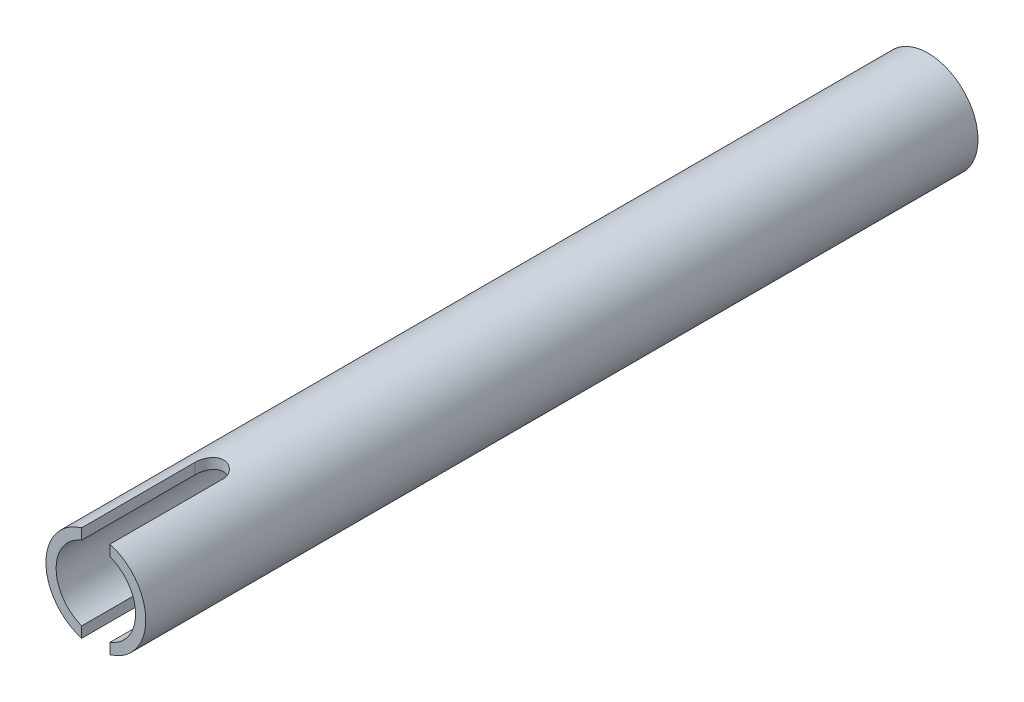
ISO-10303-21;
HEADER;
FILE_DESCRIPTION(('STEP AP214'),'2;1');
FILE_NAME('part.step','',(''),(''),'','','');
FILE_SCHEMA(('AUTOMOTIVE_DESIGN { 1 0 10303 214 1 1 1 1 }'));
ENDSEC;
DATA;
#1=APPLICATION_CONTEXT('core data for automotive mechanical design processes');
#2=APPLICATION_PROTOCOL_DEFINITION('international standard','automotive_design',2000,#1);
#3=PRODUCT_CONTEXT('',#1,'mechanical');
#4=PRODUCT('Part','Part','',(#3));
#5=PRODUCT_RELATED_PRODUCT_CATEGORY('part','',(#4));
#6=PRODUCT_DEFINITION_FORMATION('','',#4);
#7=PRODUCT_DEFINITION_CONTEXT('part definition',#1,'design');
#8=PRODUCT_DEFINITION('design','',#6,#7);
#9=PRODUCT_DEFINITION_SHAPE('','',#8);
#10=(LENGTH_UNIT() NAMED_UNIT(*) SI_UNIT(.MILLI.,.METRE.));
#11=(NAMED_UNIT(*) PLANE_ANGLE_UNIT() SI_UNIT($,.RADIAN.));
#12=(NAMED_UNIT(*) SI_UNIT($,.STERADIAN.) SOLID_ANGLE_UNIT());
#13=UNCERTAINTY_MEASURE_WITH_UNIT(LENGTH_MEASURE(1.E-05),#10,'distance_accuracy_value','');
#14=(GEOMETRIC_REPRESENTATION_CONTEXT(3) GLOBAL_UNCERTAINTY_ASSIGNED_CONTEXT((#13)) GLOBAL_UNIT_ASSIGNED_CONTEXT((#10,
#11,#12)) REPRESENTATION_CONTEXT('',''));
#15=CARTESIAN_POINT('',(0.,0.,0.));
#16=DIRECTION('',(0.,0.,1.));
#17=DIRECTION('',(1.,0.,0.));
#18=AXIS2_PLACEMENT_3D('',#15,#16,#17);
#19=CARTESIAN_POINT('',(0.,0.,139.7));
#20=DIRECTION('',(0.,0.,-1.));
#21=DIRECTION('',(0.,-1.,0.));
#22=AXIS2_PLACEMENT_3D('',#19,#20,#21);
#23=CYLINDRICAL_SURFACE('',#22,13.335);
#24=CARTESIAN_POINT('',(0.,0.,139.7));
#25=DIRECTION('',(0.,0.,1.));
#26=DIRECTION('',(1.,0.,0.));
#27=AXIS2_PLACEMENT_3D('',#24,#25,#26);
#28=CIRCLE('',#27,13.335);
#29=CARTESIAN_POINT('',(-4.7625,12.4555537311675,139.7));
#30=VERTEX_POINT('',#29);
#31=CARTESIAN_POINT('',(-4.7625,-12.4555537311675,139.7));
#32=VERTEX_POINT('',#31);
#33=EDGE_CURVE('E10',#30,#32,#28,.T.);
#34=ORIENTED_EDGE('',*,*,#33,.T.);
#35=DIRECTION('',(0.,0.,-1.));
#36=VECTOR('',#35,1.);
#37=CARTESIAN_POINT('',(-4.7625,-12.4555537311675,139.7));
#38=LINE('',#37,#36);
#39=CARTESIAN_POINT('',(-4.7625,-12.4555537311675,101.6));
#40=VERTEX_POINT('',#39);
#41=EDGE_CURVE('E36',#40,#32,#38,.F.);
#42=ORIENTED_EDGE('',*,*,#41,.F.);
#43=CARTESIAN_POINT('',(4.7625,-12.4555537311675,101.6));
#44=CARTESIAN_POINT('',(4.76251896990271,-12.4555305189485,101.470673163287));
#45=CARTESIAN_POINT('',(4.75723299616556,-12.4575671832439,101.341355556356));
#46=CARTESIAN_POINT('',(4.73619329008176,-12.4655898676531,101.083736462585));
#47=CARTESIAN_POINT('',(4.72044276284744,-12.4715746785138,100.955434676787));
#48=CARTESIAN_POINT('',(4.67868454557774,-12.4872976126237,100.701182373112));
#49=CARTESIAN_POINT('',(4.65271068361798,-12.4970233550824,100.575225521194));
#50=CARTESIAN_POINT('',(4.59076223314851,-12.5199130771229,100.326115426862));
#51=CARTESIAN_POINT('',(4.55478720234718,-12.5330772087624,100.202962308702));
#52=CARTESIAN_POINT('',(4.47319367156665,-12.56242958728,99.960397053191));
#53=CARTESIAN_POINT('',(4.42758463863456,-12.5786148635662,99.8409813744779));
#54=CARTESIAN_POINT('',(4.32708190477261,-12.6135409336953,99.6064943110917));
#55=CARTESIAN_POINT('',(4.27218473120114,-12.6322826828404,99.4914245710299));
#56=CARTESIAN_POINT('',(4.09411486494907,-12.6915769420752,99.1537155394354));
#57=CARTESIAN_POINT('',(3.95753892056841,-12.7352078663829,98.938502892756));
#58=CARTESIAN_POINT('',(3.64620053920867,-12.8278921512168,98.5248705082343));
#59=CARTESIAN_POINT('',(3.47011137628828,-12.8770938457904,98.3274891841221));
#60=CARTESIAN_POINT('',(3.08750300346686,-12.9741458477122,97.9643042006167));
#61=CARTESIAN_POINT('',(2.88097813618253,-13.0219959018428,97.7985064251322));
#62=CARTESIAN_POINT('',(2.43561570239317,-13.112708448999,97.4983601067961));
#63=CARTESIAN_POINT('',(2.1959852136657,-13.1553745074699,97.3651239550014));
#64=CARTESIAN_POINT('',(1.69592819242424,-13.2291268172402,97.1412786833634));
#65=CARTESIAN_POINT('',(1.43550882698456,-13.2602170386113,97.050654946274));
#66=CARTESIAN_POINT('',(0.912171018747993,-13.3062545370507,96.9181943979613));
#67=CARTESIAN_POINT('',(0.649757067674647,-13.3217906307815,96.8745728755163));
#68=CARTESIAN_POINT('',(0.120899520019168,-13.3370725945615,96.8316547736225));
#69=CARTESIAN_POINT('',(-0.145542940966851,-13.3368228344738,96.8323459274747));
#70=CARTESIAN_POINT('',(-0.662165140245541,-13.3209460240892,96.8769549107394));
#71=CARTESIAN_POINT('',(-0.91253760153073,-13.3060105649123,96.9189286495626));
#72=CARTESIAN_POINT('',(-1.40241500609256,-13.2633306846173,97.0416655564185));
#73=CARTESIAN_POINT('',(-1.64191933438317,-13.2355855396382,97.1224309165321));
#74=CARTESIAN_POINT('',(-2.1072364281454,-13.1695795478674,97.3214586893408));
#75=CARTESIAN_POINT('',(-2.33280995091872,-13.13117662438,97.4402312978102));
#76=CARTESIAN_POINT('',(-2.76136598704558,-13.0477895807366,97.7114771735614));
#77=CARTESIAN_POINT('',(-2.96434161071919,-13.0028034631091,97.8639606765927));
#78=CARTESIAN_POINT('',(-3.35341329937753,-12.9081012878604,98.2078008266147));
#79=CARTESIAN_POINT('',(-3.53802744445235,-12.8582609355424,98.4007995107919));
#80=CARTESIAN_POINT('',(-3.8728816728411,-12.7614058483055,98.8155518539991));
#81=CARTESIAN_POINT('',(-4.02310944133483,-12.7143921301219,99.0373157703381));
#82=CARTESIAN_POINT('',(-4.22058236280989,-12.6496573132555,99.3894027748015));
#83=CARTESIAN_POINT('',(-4.28222331665841,-12.6288693049799,99.5112977546771));
#84=CARTESIAN_POINT('',(-4.39494066997287,-12.5900863663196,99.760286512102));
#85=CARTESIAN_POINT('',(-4.44602152361949,-12.5720902591322,99.8873780705633));
#86=CARTESIAN_POINT('',(-4.53709684080026,-12.5395103358245,100.145729215637));
#87=CARTESIAN_POINT('',(-4.57710380968462,-12.5249226735936,100.276983912648));
#88=CARTESIAN_POINT('',(-4.64569378069753,-12.4996433489835,100.542757779599));
#89=CARTESIAN_POINT('',(-4.67428196383583,-12.488949919881,100.67727543959));
#90=CARTESIAN_POINT('',(-4.71877242323236,-12.4722084580943,100.942791203313));
#91=CARTESIAN_POINT('',(-4.73516122759018,-12.4659826701241,101.073696674753));
#92=CARTESIAN_POINT('',(-4.75702894328793,-12.4576451960586,101.336397844667));
#93=CARTESIAN_POINT('',(-4.76251991977353,-12.4555289602735,101.468192396375));
#94=CARTESIAN_POINT('',(-4.7625,-12.4555537311675,101.6));
#95=B_SPLINE_CURVE_WITH_KNOTS('',3,(#43,#44,#45,#46,#47,#48,#49,#50,#51,#52,#53,#54,#55,#56,#57,
#58,#59,#60,#61,#62,#63,#64,#65,#66,#67,#68,#69,#70,#71,#72,#73,#74,#75,#76,#77,#78,#79,#80,#81,
#82,#83,#84,#85,#86,#87,#88,#89,#90,#91,#92,#93,#94),.UNSPECIFIED.,.F.,.F.,(4,2,2,2,2,2,2,2,2,2,
2,2,2,2,2,2,2,2,2,2,2,2,2,2,2,4),(0.,0.387842052390776,0.775565370174635,1.16201638921965,
1.54848450139156,1.93457459504615,2.3208093599989,3.09304701274473,3.89667972405865,
4.70046200333193,5.52873945181031,6.35673257038916,7.15203938608979,7.94712604475875,
8.70647989392505,9.4658766585716,10.235927976513,11.0062134295753,11.8176671643665,
12.6294110526177,13.0434739707443,13.4573618819138,13.8707804792196,14.2840112837412,
14.6797194776609,15.0749893322866),.UNSPECIFIED.);
#96=CARTESIAN_POINT('',(4.7625,-12.4555537311675,101.6));
#97=VERTEX_POINT('',#96);
#98=EDGE_CURVE('E136',#97,#40,#95,.T.);
#99=ORIENTED_EDGE('',*,*,#98,.F.);
#100=DIRECTION('',(0.,0.,-1.));
#101=VECTOR('',#100,1.);
#102=CARTESIAN_POINT('',(4.7625,-12.4555537311675,139.7));
#103=LINE('',#102,#101);
#104=CARTESIAN_POINT('',(4.7625,-12.4555537311675,139.7));
#105=VERTEX_POINT('',#104);
#106=EDGE_CURVE('E21',#105,#97,#103,.T.);
#107=ORIENTED_EDGE('',*,*,#106,.F.);
#108=CARTESIAN_POINT('',(0.,0.,139.7));
#109=DIRECTION('',(0.,0.,1.));
#110=DIRECTION('',(1.,0.,0.));
#111=AXIS2_PLACEMENT_3D('',#108,#109,#110);
#112=CIRCLE('',#111,13.335);
#113=CARTESIAN_POINT('',(4.7625,12.4555537311675,139.7));
#114=VERTEX_POINT('',#113);
#115=EDGE_CURVE('E27',#105,#114,#112,.T.);
#116=ORIENTED_EDGE('',*,*,#115,.T.);
#117=DIRECTION('',(0.,0.,-1.));
#118=VECTOR('',#117,1.);
#119=CARTESIAN_POINT('',(4.7625,12.4555537311675,139.7));
#120=LINE('',#119,#118);
#121=CARTESIAN_POINT('',(4.7625,12.4555537311675,101.6));
#122=VERTEX_POINT('',#121);
#123=EDGE_CURVE('E110',#122,#114,#120,.F.);
#124=ORIENTED_EDGE('',*,*,#123,.F.);
#125=CARTESIAN_POINT('',(-4.7625,12.4555537311675,101.6));
#126=CARTESIAN_POINT('',(-4.76251896990271,12.4555305189485,101.470673163287));
#127=CARTESIAN_POINT('',(-4.75723299616556,12.4575671832439,101.341355556356));
#128=CARTESIAN_POINT('',(-4.73619329008176,12.4655898676531,101.083736462585));
#129=CARTESIAN_POINT('',(-4.72044276284744,12.4715746785138,100.955434676787));
#130=CARTESIAN_POINT('',(-4.67868454557774,12.4872976126237,100.701182373112));
#131=CARTESIAN_POINT('',(-4.65271068361798,12.4970233550824,100.575225521194));
#132=CARTESIAN_POINT('',(-4.59076223314851,12.5199130771229,100.326115426862));
#133=CARTESIAN_POINT('',(-4.55478720234718,12.5330772087624,100.202962308702));
#134=CARTESIAN_POINT('',(-4.47319367156665,12.56242958728,99.960397053191));
#135=CARTESIAN_POINT('',(-4.42758463863456,12.5786148635662,99.8409813744779));
#136=CARTESIAN_POINT('',(-4.32708190477261,12.6135409336953,99.6064943110917));
#137=CARTESIAN_POINT('',(-4.27218473120114,12.6322826828404,99.4914245710299));
#138=CARTESIAN_POINT('',(-4.09411486494907,12.6915769420752,99.1537155394354));
#139=CARTESIAN_POINT('',(-3.95753892056841,12.7352078663829,98.938502892756));
#140=CARTESIAN_POINT('',(-3.64620053920867,12.8278921512168,98.5248705082343));
#141=CARTESIAN_POINT('',(-3.47011137628828,12.8770938457904,98.3274891841221));
#142=CARTESIAN_POINT('',(-3.08750300346686,12.9741458477122,97.9643042006167));
#143=CARTESIAN_POINT('',(-2.88097813618253,13.0219959018428,97.7985064251322));
#144=CARTESIAN_POINT('',(-2.43561570239317,13.112708448999,97.4983601067961));
#145=CARTESIAN_POINT('',(-2.1959852136657,13.1553745074699,97.3651239550014));
#146=CARTESIAN_POINT('',(-1.69592819242424,13.2291268172402,97.1412786833634));
#147=CARTESIAN_POINT('',(-1.43550882698456,13.2602170386113,97.050654946274));
#148=CARTESIAN_POINT('',(-0.912171018747993,13.3062545370507,96.9181943979613));
#149=CARTESIAN_POINT('',(-0.649757067674647,13.3217906307815,96.8745728755163));
#150=CARTESIAN_POINT('',(-0.120899520019168,13.3370725945615,96.8316547736225));
#151=CARTESIAN_POINT('',(0.145542940966851,13.3368228344738,96.8323459274747));
#152=CARTESIAN_POINT('',(0.662165140245541,13.3209460240892,96.8769549107394));
#153=CARTESIAN_POINT('',(0.91253760153073,13.3060105649123,96.9189286495626));
#154=CARTESIAN_POINT('',(1.40241500609256,13.2633306846173,97.0416655564185));
#155=CARTESIAN_POINT('',(1.64191933438317,13.2355855396382,97.1224309165321));
#156=CARTESIAN_POINT('',(2.1072364281454,13.1695795478674,97.3214586893408));
#157=CARTESIAN_POINT('',(2.33280995091872,13.13117662438,97.4402312978102));
#158=CARTESIAN_POINT('',(2.76136598704558,13.0477895807366,97.7114771735614));
#159=CARTESIAN_POINT('',(2.96434161071919,13.0028034631091,97.8639606765927));
#160=CARTESIAN_POINT('',(3.35341329937753,12.9081012878604,98.2078008266147));
#161=CARTESIAN_POINT('',(3.53802744445235,12.8582609355424,98.4007995107919));
#162=CARTESIAN_POINT('',(3.8728816728411,12.7614058483055,98.8155518539991));
#163=CARTESIAN_POINT('',(4.02310944133483,12.7143921301219,99.0373157703381));
#164=CARTESIAN_POINT('',(4.22058236280989,12.6496573132555,99.3894027748015));
#165=CARTESIAN_POINT('',(4.28222331665841,12.6288693049799,99.5112977546771));
#166=CARTESIAN_POINT('',(4.39494066997287,12.5900863663196,99.760286512102));
#167=CARTESIAN_POINT('',(4.44602152361949,12.5720902591322,99.8873780705633));
#168=CARTESIAN_POINT('',(4.53709684080026,12.5395103358245,100.145729215637));
#169=CARTESIAN_POINT('',(4.57710380968462,12.5249226735936,100.276983912648));
#170=CARTESIAN_POINT('',(4.64569378069753,12.4996433489835,100.542757779599));
#171=CARTESIAN_POINT('',(4.67428196383583,12.488949919881,100.67727543959));
#172=CARTESIAN_POINT('',(4.71877242323236,12.4722084580943,100.942791203313));
#173=CARTESIAN_POINT('',(4.73516122759018,12.4659826701241,101.073696674753));
#174=CARTESIAN_POINT('',(4.75702894328793,12.4576451960586,101.336397844667));
#175=CARTESIAN_POINT('',(4.76251991977353,12.4555289602735,101.468192396375));
#176=CARTESIAN_POINT('',(4.7625,12.4555537311675,101.6));
#177=B_SPLINE_CURVE_WITH_KNOTS('',3,(#125,#126,#127,#128,#129,#130,#131,#132,#133,#134,#135,
#136,#137,#138,#139,#140,#141,#142,#143,#144,#145,#146,#147,#148,#149,#150,#151,#152,#153,#154,
#155,#156,#157,#158,#159,#160,#161,#162,#163,#164,#165,#166,#167,#168,#169,#170,#171,#172,#173,
#174,#175,#176),.UNSPECIFIED.,.F.,.F.,(4,2,2,2,2,2,2,2,2,2,2,2,2,2,2,2,2,2,2,2,2,2,2,2,2,4),(0.,
0.387842052390776,0.775565370174635,1.16201638921965,1.54848450139156,1.93457459504615,
2.3208093599989,3.09304701274473,3.89667972405865,4.70046200333193,5.52873945181031,
6.35673257038916,7.15203938608979,7.94712604475875,8.70647989392505,9.4658766585716,
10.235927976513,11.0062134295753,11.8176671643665,12.6294110526177,13.0434739707443,
13.4573618819138,13.8707804792196,14.2840112837412,14.6797194776609,15.0749893322866),.UNSPECIFIED.);
#178=CARTESIAN_POINT('',(-4.7625,12.4555537311675,101.6));
#179=VERTEX_POINT('',#178);
#180=EDGE_CURVE('E115',#179,#122,#177,.T.);
#181=ORIENTED_EDGE('',*,*,#180,.F.);
#182=DIRECTION('',(0.,0.,-1.));
#183=VECTOR('',#182,1.);
#184=CARTESIAN_POINT('',(-4.7625,12.4555537311675,139.7));
#185=LINE('',#184,#183);
#186=EDGE_CURVE('E122',#30,#179,#185,.T.);
#187=ORIENTED_EDGE('',*,*,#186,.F.);
#188=EDGE_LOOP('',(#34,#42,#99,#107,#116,#124,#181,#187));
#189=FACE_BOUND('',#188,.T.);
#190=CARTESIAN_POINT('',(0.,0.,-139.7));
#191=DIRECTION('',(0.,0.,1.));
#192=DIRECTION('',(1.,0.,0.));
#193=AXIS2_PLACEMENT_3D('',#190,#191,#192);
#194=CIRCLE('',#193,13.335);
#195=CARTESIAN_POINT('',(13.335,0.,-139.7));
#196=VERTEX_POINT('',#195);
#197=EDGE_CURVE('E104',#196,#196,#194,.T.);
#198=ORIENTED_EDGE('',*,*,#197,.F.);
#199=EDGE_LOOP('',(#198));
#200=FACE_BOUND('',#199,.T.);
#201=ADVANCED_FACE('F16',(#189,#200),#23,.F.);
#202=CARTESIAN_POINT('',(0.,0.,139.7));
#203=DIRECTION('',(0.,0.,-1.));
#204=DIRECTION('',(0.,-1.,0.));
#205=AXIS2_PLACEMENT_3D('',#202,#203,#204);
#206=CYLINDRICAL_SURFACE('',#205,16.764);
#207=CARTESIAN_POINT('',(0.,0.,139.7));
#208=DIRECTION('',(0.,0.,1.));
#209=DIRECTION('',(1.,0.,0.));
#210=AXIS2_PLACEMENT_3D('',#207,#208,#209);
#211=CIRCLE('',#210,16.764);
#212=CARTESIAN_POINT('',(-4.7625,16.073278749216,139.7));
#213=VERTEX_POINT('',#212);
#214=CARTESIAN_POINT('',(-4.7625,-16.073278749216,139.7));
#215=VERTEX_POINT('',#214);
#216=EDGE_CURVE('E84',#213,#215,#211,.T.);
#217=ORIENTED_EDGE('',*,*,#216,.F.);
#218=DIRECTION('',(0.,0.,-1.));
#219=VECTOR('',#218,1.);
#220=CARTESIAN_POINT('',(-4.7625,16.073278749216,139.7));
#221=LINE('',#220,#219);
#222=CARTESIAN_POINT('',(-4.7625,16.073278749216,101.6));
#223=VERTEX_POINT('',#222);
#224=EDGE_CURVE('E161',#213,#223,#221,.T.);
#225=ORIENTED_EDGE('',*,*,#224,.T.);
#226=CARTESIAN_POINT('',(-4.7625,16.073278749216,101.6));
#227=CARTESIAN_POINT('',(-4.76251724948656,16.0732611896716,101.468955883544));
#228=CARTESIAN_POINT('',(-4.7570920588267,16.0748807575252,101.3379182994));
#229=CARTESIAN_POINT('',(-4.73548476035961,16.0812659233639,101.07683629261));
#230=CARTESIAN_POINT('',(-4.71930486251197,16.08603087501,100.946791671474));
#231=CARTESIAN_POINT('',(-4.67636636824611,16.0985639844617,100.688923456025));
#232=CARTESIAN_POINT('',(-4.64963264191686,16.1063250809103,100.561095372444));
#233=CARTESIAN_POINT('',(-4.58582492288583,16.1246089356583,100.308250520065));
#234=CARTESIAN_POINT('',(-4.54875070386823,16.1351317544015,100.183233812863));
#235=CARTESIAN_POINT('',(-4.46458260990023,16.1586231616665,99.9369208038155));
#236=CARTESIAN_POINT('',(-4.41749370478002,16.1715905367055,99.8156226906387));
#237=CARTESIAN_POINT('',(-4.31365975020398,16.1995963946442,99.5774646016206));
#238=CARTESIAN_POINT('',(-4.2569111119895,16.2146356468849,99.4606062950534));
#239=CARTESIAN_POINT('',(-4.07276570567435,16.2622379067846,99.1178362357853));
#240=CARTESIAN_POINT('',(-3.93141419798287,16.2973016078453,98.8995685275046));
#241=CARTESIAN_POINT('',(-3.6114791571377,16.3712085634614,98.4840379825384));
#242=CARTESIAN_POINT('',(-3.43203790866191,16.4101254105516,98.2874529261229));
#243=CARTESIAN_POINT('',(-3.04278060652945,16.4867362816093,97.9266791832098));
#244=CARTESIAN_POINT('',(-2.83295953546291,16.5244301023255,97.7624958586574));
#245=CARTESIAN_POINT('',(-2.38415515331698,16.5951790806865,97.468353444884));
#246=CARTESIAN_POINT('',(-2.14470707018595,16.6281363433139,97.3390782106229));
#247=CARTESIAN_POINT('',(-1.64638760982651,16.6848398852155,97.122888478153));
#248=CARTESIAN_POINT('',(-1.3875208544157,16.7085883480173,97.0359639367829));
#249=CARTESIAN_POINT('',(-0.864795550889947,16.7436746947637,96.909159228929));
#250=CARTESIAN_POINT('',(-0.601238307991513,16.7553170885924,96.8681227028745));
#251=CARTESIAN_POINT('',(-0.070734408104178,16.7659483512264,96.8306101354152));
#252=CARTESIAN_POINT('',(0.196211672500877,16.7649393437627,96.8341266151087));
#253=CARTESIAN_POINT('',(0.717824083367126,16.7505999796956,96.8848280902895));
#254=CARTESIAN_POINT('',(0.972623274808442,16.7376227912196,96.9307614592315));
#255=CARTESIAN_POINT('',(1.47073172764273,16.7012288688278,97.0629558308961));
#256=CARTESIAN_POINT('',(1.71404041102806,16.677811610362,97.1492188599497));
#257=CARTESIAN_POINT('',(2.18535607341735,16.622661339885,97.3605371954948));
#258=CARTESIAN_POINT('',(2.41316808800084,16.5908407456558,97.4860037775967));
#259=CARTESIAN_POINT('',(2.84489478930876,16.5222919788657,97.7718051011017));
#260=CARTESIAN_POINT('',(3.0488046704246,16.485562822587,97.9321468358368));
#261=CARTESIAN_POINT('',(3.43449263861149,16.4096296363326,98.2898481754515));
#262=CARTESIAN_POINT('',(3.61526035115151,16.3703839473353,98.4882970027103));
#263=CARTESIAN_POINT('',(3.85962136605943,16.3138605803713,98.8066648864177));
#264=CARTESIAN_POINT('',(3.9366532787088,16.2953985412975,98.9163184023028));
#265=CARTESIAN_POINT('',(4.08128445751811,16.2597770605357,99.1418629038225));
#266=CARTESIAN_POINT('',(4.14888739154348,16.2426171135262,99.2577514395923));
#267=CARTESIAN_POINT('',(4.27471084781263,16.2099602438532,99.4960570177092));
#268=CARTESIAN_POINT('',(4.33284371018011,16.1944792585532,99.6185224768175));
#269=CARTESIAN_POINT('',(4.43851964737512,16.1658354626035,99.8681488471901));
#270=CARTESIAN_POINT('',(4.48606701871387,16.1526717118747,99.995307828894));
#271=CARTESIAN_POINT('',(4.57014667134478,16.129084398881,100.253316454826));
#272=CARTESIAN_POINT('',(4.60669045171315,16.1186579774967,100.384162088868));
#273=CARTESIAN_POINT('',(4.66848554132992,16.1008686221361,100.648642649114));
#274=CARTESIAN_POINT('',(4.69374208500207,16.0935042682453,100.782276252248));
#275=CARTESIAN_POINT('',(4.72963640067107,16.0829891356954,101.029908058656));
#276=CARTESIAN_POINT('',(4.74196167968676,16.0793541128088,101.143644218613));
#277=CARTESIAN_POINT('',(4.75839160191548,16.0744959165157,101.371583929747));
#278=CARTESIAN_POINT('',(4.76250882843589,16.0732690513415,101.485786496121));
#279=CARTESIAN_POINT('',(4.7625,16.073278749216,101.6));
#280=B_SPLINE_CURVE_WITH_KNOTS('',3,(#226,#227,#228,#229,#230,#231,#232,#233,#234,#235,#236,
#237,#238,#239,#240,#241,#242,#243,#244,#245,#246,#247,#248,#249,#250,#251,#252,#253,#254,#255,
#256,#257,#258,#259,#260,#261,#262,#263,#264,#265,#266,#267,#268,#269,#270,#271,#272,#273,#274,
#275,#276,#277,#278,#279),.UNSPECIFIED.,.F.,.F.,(4,2,2,2,2,2,2,2,2,2,2,2,2,2,2,2,2,2,2,2,2,2,2,
2,2,2,4),(0.,0.39299994978362,0.785919167882713,1.17791794676906,1.5699253057586,
1.96173858148516,2.35369774163364,3.13710982004263,3.94050445129286,4.74403191965503,
5.56231521660238,6.38040436900443,7.17737768751932,7.97421722367547,8.74827022506702,
9.52236212230428,10.304864123608,11.0875231808436,11.8972730749833,12.3027008694317,
12.7079705102789,13.1168011369477,13.5254655208944,13.9337013443969,14.341747652749,
14.6848133446769,15.0273526960473),.UNSPECIFIED.);
#281=CARTESIAN_POINT('',(4.7625,16.073278749216,101.6));
#282=VERTEX_POINT('',#281);
#283=EDGE_CURVE('E163',#223,#282,#280,.T.);
#284=ORIENTED_EDGE('',*,*,#283,.T.);
#285=DIRECTION('',(0.,0.,-1.));
#286=VECTOR('',#285,1.);
#287=CARTESIAN_POINT('',(4.7625,16.073278749216,139.7));
#288=LINE('',#287,#286);
#289=CARTESIAN_POINT('',(4.7625,16.073278749216,139.7));
#290=VERTEX_POINT('',#289);
#291=EDGE_CURVE('E169',#282,#290,#288,.F.);
#292=ORIENTED_EDGE('',*,*,#291,.T.);
#293=CARTESIAN_POINT('',(0.,0.,139.7));
#294=DIRECTION('',(0.,0.,1.));
#295=DIRECTION('',(1.,0.,0.));
#296=AXIS2_PLACEMENT_3D('',#293,#294,#295);
#297=CIRCLE('',#296,16.764);
#298=CARTESIAN_POINT('',(4.7625,-16.073278749216,139.7));
#299=VERTEX_POINT('',#298);
#300=EDGE_CURVE('E102',#299,#290,#297,.T.);
#301=ORIENTED_EDGE('',*,*,#300,.F.);
#302=DIRECTION('',(0.,0.,-1.));
#303=VECTOR('',#302,1.);
#304=CARTESIAN_POINT('',(4.7625,-16.073278749216,139.7));
#305=LINE('',#304,#303);
#306=CARTESIAN_POINT('',(4.7625,-16.073278749216,101.6));
#307=VERTEX_POINT('',#306);
#308=EDGE_CURVE('E172',#299,#307,#305,.T.);
#309=ORIENTED_EDGE('',*,*,#308,.T.);
#310=CARTESIAN_POINT('',(4.7625,-16.073278749216,101.6));
#311=CARTESIAN_POINT('',(4.76251724948656,-16.0732611896716,101.468955883544));
#312=CARTESIAN_POINT('',(4.7570920588267,-16.0748807575252,101.3379182994));
#313=CARTESIAN_POINT('',(4.73548476035961,-16.0812659233639,101.07683629261));
#314=CARTESIAN_POINT('',(4.71930486251197,-16.08603087501,100.946791671474));
#315=CARTESIAN_POINT('',(4.67636636824611,-16.0985639844617,100.688923456025));
#316=CARTESIAN_POINT('',(4.64963264191686,-16.1063250809103,100.561095372444));
#317=CARTESIAN_POINT('',(4.58582492288583,-16.1246089356583,100.308250520065));
#318=CARTESIAN_POINT('',(4.54875070386823,-16.1351317544015,100.183233812863));
#319=CARTESIAN_POINT('',(4.46458260990023,-16.1586231616665,99.9369208038155));
#320=CARTESIAN_POINT('',(4.41749370478002,-16.1715905367055,99.8156226906387));
#321=CARTESIAN_POINT('',(4.31365975020398,-16.1995963946442,99.5774646016206));
#322=CARTESIAN_POINT('',(4.2569111119895,-16.2146356468849,99.4606062950534));
#323=CARTESIAN_POINT('',(4.07276570567435,-16.2622379067846,99.1178362357853));
#324=CARTESIAN_POINT('',(3.93141419798287,-16.2973016078453,98.8995685275046));
#325=CARTESIAN_POINT('',(3.6114791571377,-16.3712085634614,98.4840379825384));
#326=CARTESIAN_POINT('',(3.43203790866191,-16.4101254105516,98.2874529261229));
#327=CARTESIAN_POINT('',(3.04278060652945,-16.4867362816093,97.9266791832098));
#328=CARTESIAN_POINT('',(2.83295953546291,-16.5244301023255,97.7624958586574));
#329=CARTESIAN_POINT('',(2.38415515331698,-16.5951790806865,97.468353444884));
#330=CARTESIAN_POINT('',(2.14470707018595,-16.6281363433139,97.3390782106229));
#331=CARTESIAN_POINT('',(1.64638760982651,-16.6848398852155,97.122888478153));
#332=CARTESIAN_POINT('',(1.3875208544157,-16.7085883480173,97.0359639367829));
#333=CARTESIAN_POINT('',(0.864795550889947,-16.7436746947637,96.909159228929));
#334=CARTESIAN_POINT('',(0.601238307991513,-16.7553170885924,96.8681227028745));
#335=CARTESIAN_POINT('',(0.070734408104178,-16.7659483512264,96.8306101354152));
#336=CARTESIAN_POINT('',(-0.196211672500877,-16.7649393437627,96.8341266151087));
#337=CARTESIAN_POINT('',(-0.717824083367126,-16.7505999796956,96.8848280902895));
#338=CARTESIAN_POINT('',(-0.972623274808442,-16.7376227912196,96.9307614592315));
#339=CARTESIAN_POINT('',(-1.47073172764273,-16.7012288688278,97.0629558308961));
#340=CARTESIAN_POINT('',(-1.71404041102806,-16.677811610362,97.1492188599497));
#341=CARTESIAN_POINT('',(-2.18535607341735,-16.622661339885,97.3605371954948));
#342=CARTESIAN_POINT('',(-2.41316808800084,-16.5908407456558,97.4860037775967));
#343=CARTESIAN_POINT('',(-2.84489478930876,-16.5222919788657,97.7718051011017));
#344=CARTESIAN_POINT('',(-3.0488046704246,-16.485562822587,97.9321468358368));
#345=CARTESIAN_POINT('',(-3.43449263861149,-16.4096296363326,98.2898481754515));
#346=CARTESIAN_POINT('',(-3.61526035115151,-16.3703839473353,98.4882970027103));
#347=CARTESIAN_POINT('',(-3.85962136605943,-16.3138605803713,98.8066648864177));
#348=CARTESIAN_POINT('',(-3.9366532787088,-16.2953985412975,98.9163184023028));
#349=CARTESIAN_POINT('',(-4.08128445751811,-16.2597770605357,99.1418629038225));
#350=CARTESIAN_POINT('',(-4.14888739154348,-16.2426171135262,99.2577514395923));
#351=CARTESIAN_POINT('',(-4.27471084781263,-16.2099602438532,99.4960570177092));
#352=CARTESIAN_POINT('',(-4.33284371018011,-16.1944792585532,99.6185224768175));
#353=CARTESIAN_POINT('',(-4.43851964737512,-16.1658354626035,99.8681488471901));
#354=CARTESIAN_POINT('',(-4.48606701871387,-16.1526717118747,99.995307828894));
#355=CARTESIAN_POINT('',(-4.57014667134478,-16.129084398881,100.253316454826));
#356=CARTESIAN_POINT('',(-4.60669045171315,-16.1186579774967,100.384162088868));
#357=CARTESIAN_POINT('',(-4.66848554132992,-16.1008686221361,100.648642649114));
#358=CARTESIAN_POINT('',(-4.69374208500207,-16.0935042682453,100.782276252248));
#359=CARTESIAN_POINT('',(-4.72963640067107,-16.0829891356954,101.029908058656));
#360=CARTESIAN_POINT('',(-4.74196167968676,-16.0793541128088,101.143644218613));
#361=CARTESIAN_POINT('',(-4.75839160191548,-16.0744959165157,101.371583929747));
#362=CARTESIAN_POINT('',(-4.76250882843589,-16.0732690513415,101.485786496121));
#363=CARTESIAN_POINT('',(-4.7625,-16.073278749216,101.6));
#364=B_SPLINE_CURVE_WITH_KNOTS('',3,(#310,#311,#312,#313,#314,#315,#316,#317,#318,#319,#320,
#321,#322,#323,#324,#325,#326,#327,#328,#329,#330,#331,#332,#333,#334,#335,#336,#337,#338,#339,
#340,#341,#342,#343,#344,#345,#346,#347,#348,#349,#350,#351,#352,#353,#354,#355,#356,#357,#358,
#359,#360,#361,#362,#363),.UNSPECIFIED.,.F.,.F.,(4,2,2,2,2,2,2,2,2,2,2,2,2,2,2,2,2,2,2,2,2,2,2,
2,2,2,4),(0.,0.39299994978362,0.785919167882713,1.17791794676906,1.5699253057586,
1.96173858148516,2.35369774163364,3.13710982004263,3.94050445129286,4.74403191965503,
5.56231521660238,6.38040436900443,7.17737768751932,7.97421722367547,8.74827022506702,
9.52236212230428,10.304864123608,11.0875231808436,11.8972730749833,12.3027008694317,
12.7079705102789,13.1168011369477,13.5254655208944,13.9337013443969,14.341747652749,
14.6848133446769,15.0273526960473),.UNSPECIFIED.);
#365=CARTESIAN_POINT('',(-4.7625,-16.073278749216,101.6));
#366=VERTEX_POINT('',#365);
#367=EDGE_CURVE('E97',#307,#366,#364,.T.);
#368=ORIENTED_EDGE('',*,*,#367,.T.);
#369=DIRECTION('',(0.,0.,-1.));
#370=VECTOR('',#369,1.);
#371=CARTESIAN_POINT('',(-4.7625,-16.073278749216,139.7));
#372=LINE('',#371,#370);
#373=EDGE_CURVE('E78',#366,#215,#372,.F.);
#374=ORIENTED_EDGE('',*,*,#373,.T.);
#375=EDGE_LOOP('',(#217,#225,#284,#292,#301,#309,#368,#374));
#376=FACE_BOUND('',#375,.T.);
#377=CARTESIAN_POINT('',(0.,0.,-139.7));
#378=DIRECTION('',(0.,0.,1.));
#379=DIRECTION('',(1.,0.,0.));
#380=AXIS2_PLACEMENT_3D('',#377,#378,#379);
#381=CIRCLE('',#380,16.764);
#382=CARTESIAN_POINT('',(16.764,0.,-139.7));
#383=VERTEX_POINT('',#382);
#384=EDGE_CURVE('E99',#383,#383,#381,.T.);
#385=ORIENTED_EDGE('',*,*,#384,.T.);
#386=EDGE_LOOP('',(#385));
#387=FACE_BOUND('',#386,.T.);
#388=ADVANCED_FACE('F94',(#376,#387),#206,.T.);
#389=CARTESIAN_POINT('',(0.,0.,139.7));
#390=DIRECTION('',(0.,0.,1.));
#391=DIRECTION('',(1.,0.,0.));
#392=AXIS2_PLACEMENT_3D('',#389,#390,#391);
#393=PLANE('',#392);
#394=DIRECTION('',(0.,-1.,0.));
#395=VECTOR('',#394,1.);
#396=CARTESIAN_POINT('',(-4.7625,0.,139.7));
#397=LINE('',#396,#395);
#398=EDGE_CURVE('E89',#30,#213,#397,.F.);
#399=ORIENTED_EDGE('',*,*,#398,.T.);
#400=ORIENTED_EDGE('',*,*,#216,.T.);
#401=DIRECTION('',(0.,-1.,0.));
#402=VECTOR('',#401,1.);
#403=CARTESIAN_POINT('',(-4.7625,0.,139.7));
#404=LINE('',#403,#402);
#405=EDGE_CURVE('E87',#215,#32,#404,.F.);
#406=ORIENTED_EDGE('',*,*,#405,.T.);
#407=ORIENTED_EDGE('',*,*,#33,.F.);
#408=EDGE_LOOP('',(#399,#400,#406,#407));
#409=FACE_BOUND('',#408,.T.);
#410=ADVANCED_FACE('F85',(#409),#393,.T.);
#411=CARTESIAN_POINT('',(0.,0.,139.7));
#412=DIRECTION('',(0.,0.,1.));
#413=DIRECTION('',(1.,0.,0.));
#414=AXIS2_PLACEMENT_3D('',#411,#412,#413);
#415=PLANE('',#414);
#416=DIRECTION('',(0.,-1.,0.));
#417=VECTOR('',#416,1.);
#418=CARTESIAN_POINT('',(4.7625,-16.764,139.7));
#419=LINE('',#418,#417);
#420=EDGE_CURVE('E141',#299,#105,#419,.F.);
#421=ORIENTED_EDGE('',*,*,#420,.F.);
#422=ORIENTED_EDGE('',*,*,#300,.T.);
#423=DIRECTION('',(0.,-1.,0.));
#424=VECTOR('',#423,1.);
#425=CARTESIAN_POINT('',(4.7625,-16.764,139.7));
#426=LINE('',#425,#424);
#427=EDGE_CURVE('E112',#114,#290,#426,.F.);
#428=ORIENTED_EDGE('',*,*,#427,.F.);
#429=ORIENTED_EDGE('',*,*,#115,.F.);
#430=EDGE_LOOP('',(#421,#422,#428,#429));
#431=FACE_BOUND('',#430,.T.);
#432=ADVANCED_FACE('F185',(#431),#415,.T.);
#433=CARTESIAN_POINT('',(0.,0.,-139.7));
#434=DIRECTION('',(0.,0.,1.));
#435=DIRECTION('',(1.,0.,0.));
#436=AXIS2_PLACEMENT_3D('',#433,#434,#435);
#437=PLANE('',#436);
#438=ORIENTED_EDGE('',*,*,#384,.F.);
#439=EDGE_LOOP('',(#438));
#440=FACE_BOUND('',#439,.T.);
#441=ORIENTED_EDGE('',*,*,#197,.T.);
#442=EDGE_LOOP('',(#441));
#443=FACE_BOUND('',#442,.T.);
#444=ADVANCED_FACE('F181',(#440,#443),#437,.F.);
#445=CARTESIAN_POINT('',(4.7625,-16.764,101.6));
#446=DIRECTION('',(1.,0.,0.));
#447=DIRECTION('',(0.,0.,-1.));
#448=AXIS2_PLACEMENT_3D('',#445,#446,#447);
#449=PLANE('',#448);
#450=DIRECTION('',(0.,1.,0.));
#451=VECTOR('',#450,1.);
#452=CARTESIAN_POINT('',(4.7625,12.4555537311675,101.6));
#453=LINE('',#452,#451);
#454=EDGE_CURVE('E121',#122,#282,#453,.T.);
#455=ORIENTED_EDGE('',*,*,#454,.F.);
#456=ORIENTED_EDGE('',*,*,#123,.T.);
#457=ORIENTED_EDGE('',*,*,#427,.T.);
#458=ORIENTED_EDGE('',*,*,#291,.F.);
#459=EDGE_LOOP('',(#455,#456,#457,#458));
#460=FACE_BOUND('',#459,.T.);
#461=ADVANCED_FACE('F184',(#460),#449,.F.);
#462=CARTESIAN_POINT('',(0.,-16.764,101.6));
#463=DIRECTION('',(0.,1.,0.));
#464=DIRECTION('',(1.,0.,0.));
#465=AXIS2_PLACEMENT_3D('',#462,#463,#464);
#466=CYLINDRICAL_SURFACE('',#465,4.7625);
#467=DIRECTION('',(0.,1.,0.));
#468=VECTOR('',#467,1.);
#469=CARTESIAN_POINT('',(-4.7625,12.4555537311675,101.6));
#470=LINE('',#469,#468);
#471=EDGE_CURVE('E158',#179,#223,#470,.T.);
#472=ORIENTED_EDGE('',*,*,#471,.F.);
#473=ORIENTED_EDGE('',*,*,#180,.T.);
#474=ORIENTED_EDGE('',*,*,#454,.T.);
#475=ORIENTED_EDGE('',*,*,#283,.F.);
#476=EDGE_LOOP('',(#472,#473,#474,#475));
#477=FACE_BOUND('',#476,.T.);
#478=ADVANCED_FACE('F124',(#477),#466,.F.);
#479=CARTESIAN_POINT('',(-4.7625,-16.764,139.7));
#480=DIRECTION('',(-1.,0.,0.));
#481=DIRECTION('',(0.,0.,1.));
#482=AXIS2_PLACEMENT_3D('',#479,#480,#481);
#483=PLANE('',#482);
#484=ORIENTED_EDGE('',*,*,#398,.F.);
#485=ORIENTED_EDGE('',*,*,#186,.T.);
#486=ORIENTED_EDGE('',*,*,#471,.T.);
#487=ORIENTED_EDGE('',*,*,#224,.F.);
#488=EDGE_LOOP('',(#484,#485,#486,#487));
#489=FACE_BOUND('',#488,.T.);
#490=ADVANCED_FACE('F199',(#489),#483,.F.);
#491=CARTESIAN_POINT('',(-4.7625,-16.764,139.7));
#492=DIRECTION('',(-1.,0.,0.));
#493=DIRECTION('',(0.,0.,1.));
#494=AXIS2_PLACEMENT_3D('',#491,#492,#493);
#495=PLANE('',#494);
#496=DIRECTION('',(0.,1.,0.));
#497=VECTOR('',#496,1.);
#498=CARTESIAN_POINT('',(-4.7625,-16.0732787492161,101.6));
#499=LINE('',#498,#497);
#500=EDGE_CURVE('E154',#366,#40,#499,.T.);
#501=ORIENTED_EDGE('',*,*,#500,.T.);
#502=ORIENTED_EDGE('',*,*,#41,.T.);
#503=ORIENTED_EDGE('',*,*,#405,.F.);
#504=ORIENTED_EDGE('',*,*,#373,.F.);
#505=EDGE_LOOP('',(#501,#502,#503,#504));
#506=FACE_BOUND('',#505,.T.);
#507=ADVANCED_FACE('F101',(#506),#495,.F.);
#508=CARTESIAN_POINT('',(0.,-16.764,101.6));
#509=DIRECTION('',(0.,1.,0.));
#510=DIRECTION('',(1.,0.,0.));
#511=AXIS2_PLACEMENT_3D('',#508,#509,#510);
#512=CYLINDRICAL_SURFACE('',#511,4.7625);
#513=DIRECTION('',(0.,1.,0.));
#514=VECTOR('',#513,1.);
#515=CARTESIAN_POINT('',(4.7625,-16.0732787492161,101.6));
#516=LINE('',#515,#514);
#517=EDGE_CURVE('E140',#307,#97,#516,.T.);
#518=ORIENTED_EDGE('',*,*,#517,.T.);
#519=ORIENTED_EDGE('',*,*,#98,.T.);
#520=ORIENTED_EDGE('',*,*,#500,.F.);
#521=ORIENTED_EDGE('',*,*,#367,.F.);
#522=EDGE_LOOP('',(#518,#519,#520,#521));
#523=FACE_BOUND('',#522,.T.);
#524=ADVANCED_FACE('F18',(#523),#512,.F.);
#525=CARTESIAN_POINT('',(4.7625,-16.764,101.6));
#526=DIRECTION('',(1.,0.,0.));
#527=DIRECTION('',(0.,0.,-1.));
#528=AXIS2_PLACEMENT_3D('',#525,#526,#527);
#529=PLANE('',#528);
#530=ORIENTED_EDGE('',*,*,#420,.T.);
#531=ORIENTED_EDGE('',*,*,#106,.T.);
#532=ORIENTED_EDGE('',*,*,#517,.F.);
#533=ORIENTED_EDGE('',*,*,#308,.F.);
#534=EDGE_LOOP('',(#530,#531,#532,#533));
#535=FACE_BOUND('',#534,.T.);
#536=ADVANCED_FACE('F131',(#535),#529,.F.);
#537=CLOSED_SHELL('',(#201,#388,#410,#432,#444,#461,#478,#490,#507,#524,#536));
#538=MANIFOLD_SOLID_BREP('B1',#537);
#539=ADVANCED_BREP_SHAPE_REPRESENTATION('',(#18,#538),#14);
#540=SHAPE_DEFINITION_REPRESENTATION(#9,#539);
ENDSEC;
END-ISO-10303-21;
